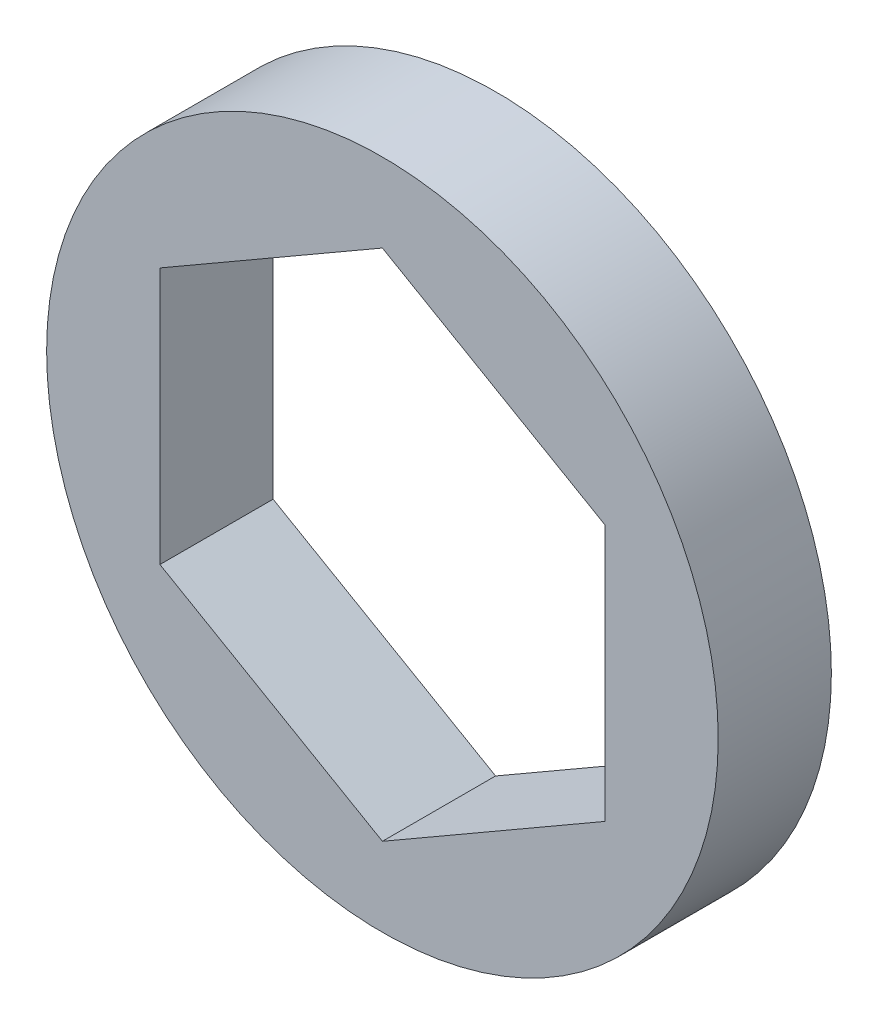
ISO-10303-21;
HEADER;
FILE_DESCRIPTION(('STEP AP214'),'2;1');
FILE_NAME('part.step','',(''),(''),'','','');
FILE_SCHEMA(('AUTOMOTIVE_DESIGN { 1 0 10303 214 1 1 1 1 }'));
ENDSEC;
DATA;
#1=APPLICATION_CONTEXT('core data for automotive mechanical design processes');
#2=APPLICATION_PROTOCOL_DEFINITION('international standard','automotive_design',2000,#1);
#3=PRODUCT_CONTEXT('',#1,'mechanical');
#4=PRODUCT('Part','Part','',(#3));
#5=PRODUCT_RELATED_PRODUCT_CATEGORY('part','',(#4));
#6=PRODUCT_DEFINITION_FORMATION('','',#4);
#7=PRODUCT_DEFINITION_CONTEXT('part definition',#1,'design');
#8=PRODUCT_DEFINITION('design','',#6,#7);
#9=PRODUCT_DEFINITION_SHAPE('','',#8);
#10=(LENGTH_UNIT() NAMED_UNIT(*) SI_UNIT(.MILLI.,.METRE.));
#11=(NAMED_UNIT(*) PLANE_ANGLE_UNIT() SI_UNIT($,.RADIAN.));
#12=(NAMED_UNIT(*) SI_UNIT($,.STERADIAN.) SOLID_ANGLE_UNIT());
#13=UNCERTAINTY_MEASURE_WITH_UNIT(LENGTH_MEASURE(1.E-05),#10,'distance_accuracy_value','');
#14=(GEOMETRIC_REPRESENTATION_CONTEXT(3) GLOBAL_UNCERTAINTY_ASSIGNED_CONTEXT((#13)) GLOBAL_UNIT_ASSIGNED_CONTEXT((#10,
#11,#12)) REPRESENTATION_CONTEXT('',''));
#15=CARTESIAN_POINT('',(0.,0.,0.));
#16=DIRECTION('',(0.,0.,1.));
#17=DIRECTION('',(1.,0.,0.));
#18=AXIS2_PLACEMENT_3D('',#15,#16,#17);
#19=CARTESIAN_POINT('',(0.,0.,3.42392));
#20=DIRECTION('',(0.,0.,1.));
#21=DIRECTION('',(1.,0.,0.));
#22=AXIS2_PLACEMENT_3D('',#19,#20,#21);
#23=PLANE('',#22);
#24=CARTESIAN_POINT('',(0.,0.,3.42392));
#25=DIRECTION('',(0.,0.,1.));
#26=DIRECTION('',(1.,0.,0.));
#27=AXIS2_PLACEMENT_3D('',#24,#25,#26);
#28=CIRCLE('',#27,10.16);
#29=CARTESIAN_POINT('',(10.16,0.,3.42392));
#30=VERTEX_POINT('',#29);
#31=EDGE_CURVE('E11',#30,#30,#28,.T.);
#32=ORIENTED_EDGE('',*,*,#31,.T.);
#33=EDGE_LOOP('',(#32));
#34=FACE_BOUND('',#33,.T.);
#35=DIRECTION('',(-0.866025403784439,0.5,0.));
#36=VECTOR('',#35,1.);
#37=CARTESIAN_POINT('',(6.731,3.88614466191537,3.42392));
#38=LINE('',#37,#36);
#39=CARTESIAN_POINT('',(6.731,3.88614466191537,3.42392));
#40=VERTEX_POINT('',#39);
#41=CARTESIAN_POINT('',(0.,7.77228932383074,3.42392));
#42=VERTEX_POINT('',#41);
#43=EDGE_CURVE('E108',#40,#42,#38,.T.);
#44=ORIENTED_EDGE('',*,*,#43,.F.);
#45=DIRECTION('',(0.,1.,0.));
#46=VECTOR('',#45,1.);
#47=CARTESIAN_POINT('',(6.731,-3.88614466191537,3.42392));
#48=LINE('',#47,#46);
#49=CARTESIAN_POINT('',(6.731,-3.88614466191537,3.42392));
#50=VERTEX_POINT('',#49);
#51=EDGE_CURVE('E99',#50,#40,#48,.T.);
#52=ORIENTED_EDGE('',*,*,#51,.F.);
#53=DIRECTION('',(0.866025403784439,0.5,0.));
#54=VECTOR('',#53,1.);
#55=CARTESIAN_POINT('',(0.,-7.77228932383074,3.42392));
#56=LINE('',#55,#54);
#57=CARTESIAN_POINT('',(0.,-7.77228932383074,3.42392));
#58=VERTEX_POINT('',#57);
#59=EDGE_CURVE('E133',#58,#50,#56,.T.);
#60=ORIENTED_EDGE('',*,*,#59,.F.);
#61=DIRECTION('',(0.866025403784439,-0.5,0.));
#62=VECTOR('',#61,1.);
#63=CARTESIAN_POINT('',(-6.731,-3.88614466191537,3.42392));
#64=LINE('',#63,#62);
#65=CARTESIAN_POINT('',(-6.731,-3.88614466191537,3.42392));
#66=VERTEX_POINT('',#65);
#67=EDGE_CURVE('E130',#66,#58,#64,.T.);
#68=ORIENTED_EDGE('',*,*,#67,.F.);
#69=DIRECTION('',(0.,-1.,0.));
#70=VECTOR('',#69,1.);
#71=CARTESIAN_POINT('',(-6.731,3.88614466191537,3.42392));
#72=LINE('',#71,#70);
#73=CARTESIAN_POINT('',(-6.731,3.88614466191537,3.42392));
#74=VERTEX_POINT('',#73);
#75=EDGE_CURVE('E125',#74,#66,#72,.T.);
#76=ORIENTED_EDGE('',*,*,#75,.F.);
#77=DIRECTION('',(-0.866025403784439,-0.5,0.));
#78=VECTOR('',#77,1.);
#79=CARTESIAN_POINT('',(0.,7.77228932383074,3.42392));
#80=LINE('',#79,#78);
#81=EDGE_CURVE('E121',#42,#74,#80,.T.);
#82=ORIENTED_EDGE('',*,*,#81,.F.);
#83=EDGE_LOOP('',(#44,#52,#60,#68,#76,#82));
#84=FACE_BOUND('',#83,.T.);
#85=ADVANCED_FACE('F45',(#34,#84),#23,.T.);
#86=CARTESIAN_POINT('',(0.,0.,0.));
#87=DIRECTION('',(0.,0.,1.));
#88=DIRECTION('',(1.,0.,0.));
#89=AXIS2_PLACEMENT_3D('',#86,#87,#88);
#90=PLANE('',#89);
#91=CARTESIAN_POINT('',(0.,0.,0.));
#92=DIRECTION('',(0.,0.,1.));
#93=DIRECTION('',(1.,0.,0.));
#94=AXIS2_PLACEMENT_3D('',#91,#92,#93);
#95=CIRCLE('',#94,10.16);
#96=CARTESIAN_POINT('',(10.16,0.,0.));
#97=VERTEX_POINT('',#96);
#98=EDGE_CURVE('E49',#97,#97,#95,.T.);
#99=ORIENTED_EDGE('',*,*,#98,.F.);
#100=EDGE_LOOP('',(#99));
#101=FACE_BOUND('',#100,.T.);
#102=DIRECTION('',(0.,1.,0.));
#103=VECTOR('',#102,1.);
#104=CARTESIAN_POINT('',(6.731,-3.88614466191537,0.));
#105=LINE('',#104,#103);
#106=CARTESIAN_POINT('',(6.731,-3.88614466191537,0.));
#107=VERTEX_POINT('',#106);
#108=CARTESIAN_POINT('',(6.731,3.88614466191537,0.));
#109=VERTEX_POINT('',#108);
#110=EDGE_CURVE('E69',#107,#109,#105,.T.);
#111=ORIENTED_EDGE('',*,*,#110,.T.);
#112=DIRECTION('',(-0.866025403784439,0.5,0.));
#113=VECTOR('',#112,1.);
#114=CARTESIAN_POINT('',(6.731,3.88614466191537,0.));
#115=LINE('',#114,#113);
#116=CARTESIAN_POINT('',(0.,7.77228932383074,0.));
#117=VERTEX_POINT('',#116);
#118=EDGE_CURVE('E115',#109,#117,#115,.T.);
#119=ORIENTED_EDGE('',*,*,#118,.T.);
#120=DIRECTION('',(-0.866025403784439,-0.5,0.));
#121=VECTOR('',#120,1.);
#122=CARTESIAN_POINT('',(0.,7.77228932383074,0.));
#123=LINE('',#122,#121);
#124=CARTESIAN_POINT('',(-6.731,3.88614466191537,0.));
#125=VERTEX_POINT('',#124);
#126=EDGE_CURVE('E140',#117,#125,#123,.T.);
#127=ORIENTED_EDGE('',*,*,#126,.T.);
#128=DIRECTION('',(0.,-1.,0.));
#129=VECTOR('',#128,1.);
#130=CARTESIAN_POINT('',(-6.731,3.88614466191537,0.));
#131=LINE('',#130,#129);
#132=CARTESIAN_POINT('',(-6.731,-3.88614466191537,0.));
#133=VERTEX_POINT('',#132);
#134=EDGE_CURVE('E144',#125,#133,#131,.T.);
#135=ORIENTED_EDGE('',*,*,#134,.T.);
#136=DIRECTION('',(0.866025403784439,-0.5,0.));
#137=VECTOR('',#136,1.);
#138=CARTESIAN_POINT('',(-6.731,-3.88614466191537,0.));
#139=LINE('',#138,#137);
#140=CARTESIAN_POINT('',(0.,-7.77228932383074,0.));
#141=VERTEX_POINT('',#140);
#142=EDGE_CURVE('E148',#133,#141,#139,.T.);
#143=ORIENTED_EDGE('',*,*,#142,.T.);
#144=DIRECTION('',(0.866025403784439,0.5,0.));
#145=VECTOR('',#144,1.);
#146=CARTESIAN_POINT('',(0.,-7.77228932383074,0.));
#147=LINE('',#146,#145);
#148=EDGE_CURVE('E109',#141,#107,#147,.T.);
#149=ORIENTED_EDGE('',*,*,#148,.T.);
#150=EDGE_LOOP('',(#111,#119,#127,#135,#143,#149));
#151=FACE_BOUND('',#150,.T.);
#152=ADVANCED_FACE('F172',(#101,#151),#90,.F.);
#153=CARTESIAN_POINT('',(0.,0.,3.42392));
#154=DIRECTION('',(0.,0.,-1.));
#155=DIRECTION('',(-1.,0.,0.));
#156=AXIS2_PLACEMENT_3D('',#153,#154,#155);
#157=CYLINDRICAL_SURFACE('',#156,10.16);
#158=ORIENTED_EDGE('',*,*,#31,.F.);
#159=EDGE_LOOP('',(#158));
#160=FACE_BOUND('',#159,.T.);
#161=ORIENTED_EDGE('',*,*,#98,.T.);
#162=EDGE_LOOP('',(#161));
#163=FACE_BOUND('',#162,.T.);
#164=ADVANCED_FACE('F47',(#160,#163),#157,.T.);
#165=CARTESIAN_POINT('',(6.731,-3.88614466191537,3.42392));
#166=DIRECTION('',(-1.,0.,0.));
#167=DIRECTION('',(0.,-1.,0.));
#168=AXIS2_PLACEMENT_3D('',#165,#166,#167);
#169=PLANE('',#168);
#170=ORIENTED_EDGE('',*,*,#110,.F.);
#171=DIRECTION('',(0.,0.,-1.));
#172=VECTOR('',#171,1.);
#173=CARTESIAN_POINT('',(6.731,-3.88614466191537,3.42392));
#174=LINE('',#173,#172);
#175=EDGE_CURVE('E103',#50,#107,#174,.T.);
#176=ORIENTED_EDGE('',*,*,#175,.F.);
#177=ORIENTED_EDGE('',*,*,#51,.T.);
#178=DIRECTION('',(0.,0.,-1.));
#179=VECTOR('',#178,1.);
#180=CARTESIAN_POINT('',(6.731,3.88614466191537,3.42392));
#181=LINE('',#180,#179);
#182=EDGE_CURVE('E102',#40,#109,#181,.T.);
#183=ORIENTED_EDGE('',*,*,#182,.T.);
#184=EDGE_LOOP('',(#170,#176,#177,#183));
#185=FACE_BOUND('',#184,.T.);
#186=ADVANCED_FACE('F101',(#185),#169,.T.);
#187=CARTESIAN_POINT('',(6.731,3.88614466191537,3.42392));
#188=DIRECTION('',(-0.5,-0.866025403784439,0.));
#189=DIRECTION('',(0.866025403784439,-0.5,0.));
#190=AXIS2_PLACEMENT_3D('',#187,#188,#189);
#191=PLANE('',#190);
#192=ORIENTED_EDGE('',*,*,#118,.F.);
#193=ORIENTED_EDGE('',*,*,#182,.F.);
#194=ORIENTED_EDGE('',*,*,#43,.T.);
#195=DIRECTION('',(0.,0.,-1.));
#196=VECTOR('',#195,1.);
#197=CARTESIAN_POINT('',(0.,7.77228932383074,3.42392));
#198=LINE('',#197,#196);
#199=EDGE_CURVE('E117',#42,#117,#198,.T.);
#200=ORIENTED_EDGE('',*,*,#199,.T.);
#201=EDGE_LOOP('',(#192,#193,#194,#200));
#202=FACE_BOUND('',#201,.T.);
#203=ADVANCED_FACE('F112',(#202),#191,.T.);
#204=CARTESIAN_POINT('',(0.,7.77228932383074,3.42392));
#205=DIRECTION('',(0.5,-0.866025403784439,0.));
#206=DIRECTION('',(0.866025403784439,0.5,0.));
#207=AXIS2_PLACEMENT_3D('',#204,#205,#206);
#208=PLANE('',#207);
#209=ORIENTED_EDGE('',*,*,#126,.F.);
#210=ORIENTED_EDGE('',*,*,#199,.F.);
#211=ORIENTED_EDGE('',*,*,#81,.T.);
#212=DIRECTION('',(0.,0.,-1.));
#213=VECTOR('',#212,1.);
#214=CARTESIAN_POINT('',(-6.731,3.88614466191537,3.42392));
#215=LINE('',#214,#213);
#216=EDGE_CURVE('E162',#74,#125,#215,.T.);
#217=ORIENTED_EDGE('',*,*,#216,.T.);
#218=EDGE_LOOP('',(#209,#210,#211,#217));
#219=FACE_BOUND('',#218,.T.);
#220=ADVANCED_FACE('F168',(#219),#208,.T.);
#221=CARTESIAN_POINT('',(-6.731,3.88614466191537,3.42392));
#222=DIRECTION('',(1.,0.,0.));
#223=DIRECTION('',(0.,1.,0.));
#224=AXIS2_PLACEMENT_3D('',#221,#222,#223);
#225=PLANE('',#224);
#226=ORIENTED_EDGE('',*,*,#134,.F.);
#227=ORIENTED_EDGE('',*,*,#216,.F.);
#228=ORIENTED_EDGE('',*,*,#75,.T.);
#229=DIRECTION('',(0.,0.,-1.));
#230=VECTOR('',#229,1.);
#231=CARTESIAN_POINT('',(-6.731,-3.88614466191537,3.42392));
#232=LINE('',#231,#230);
#233=EDGE_CURVE('E159',#66,#133,#232,.T.);
#234=ORIENTED_EDGE('',*,*,#233,.T.);
#235=EDGE_LOOP('',(#226,#227,#228,#234));
#236=FACE_BOUND('',#235,.T.);
#237=ADVANCED_FACE('F180',(#236),#225,.T.);
#238=CARTESIAN_POINT('',(-6.731,-3.88614466191537,3.42392));
#239=DIRECTION('',(0.5,0.866025403784439,0.));
#240=DIRECTION('',(-0.866025403784439,0.5,0.));
#241=AXIS2_PLACEMENT_3D('',#238,#239,#240);
#242=PLANE('',#241);
#243=ORIENTED_EDGE('',*,*,#142,.F.);
#244=ORIENTED_EDGE('',*,*,#233,.F.);
#245=ORIENTED_EDGE('',*,*,#67,.T.);
#246=DIRECTION('',(0.,0.,-1.));
#247=VECTOR('',#246,1.);
#248=CARTESIAN_POINT('',(0.,-7.77228932383074,3.42392));
#249=LINE('',#248,#247);
#250=EDGE_CURVE('E61',#58,#141,#249,.T.);
#251=ORIENTED_EDGE('',*,*,#250,.T.);
#252=EDGE_LOOP('',(#243,#244,#245,#251));
#253=FACE_BOUND('',#252,.T.);
#254=ADVANCED_FACE('F178',(#253),#242,.T.);
#255=CARTESIAN_POINT('',(0.,-7.77228932383074,3.42392));
#256=DIRECTION('',(-0.5,0.866025403784439,0.));
#257=DIRECTION('',(-0.866025403784439,-0.5,0.));
#258=AXIS2_PLACEMENT_3D('',#255,#256,#257);
#259=PLANE('',#258);
#260=ORIENTED_EDGE('',*,*,#148,.F.);
#261=ORIENTED_EDGE('',*,*,#250,.F.);
#262=ORIENTED_EDGE('',*,*,#59,.T.);
#263=ORIENTED_EDGE('',*,*,#175,.T.);
#264=EDGE_LOOP('',(#260,#261,#262,#263));
#265=FACE_BOUND('',#264,.T.);
#266=ADVANCED_FACE('F174',(#265),#259,.T.);
#267=CLOSED_SHELL('',(#85,#152,#164,#186,#203,#220,#237,#254,#266));
#268=MANIFOLD_SOLID_BREP('B2',#267);
#269=ADVANCED_BREP_SHAPE_REPRESENTATION('',(#18,#268),#14);
#270=SHAPE_DEFINITION_REPRESENTATION(#9,#269);
ENDSEC;
END-ISO-10303-21;
